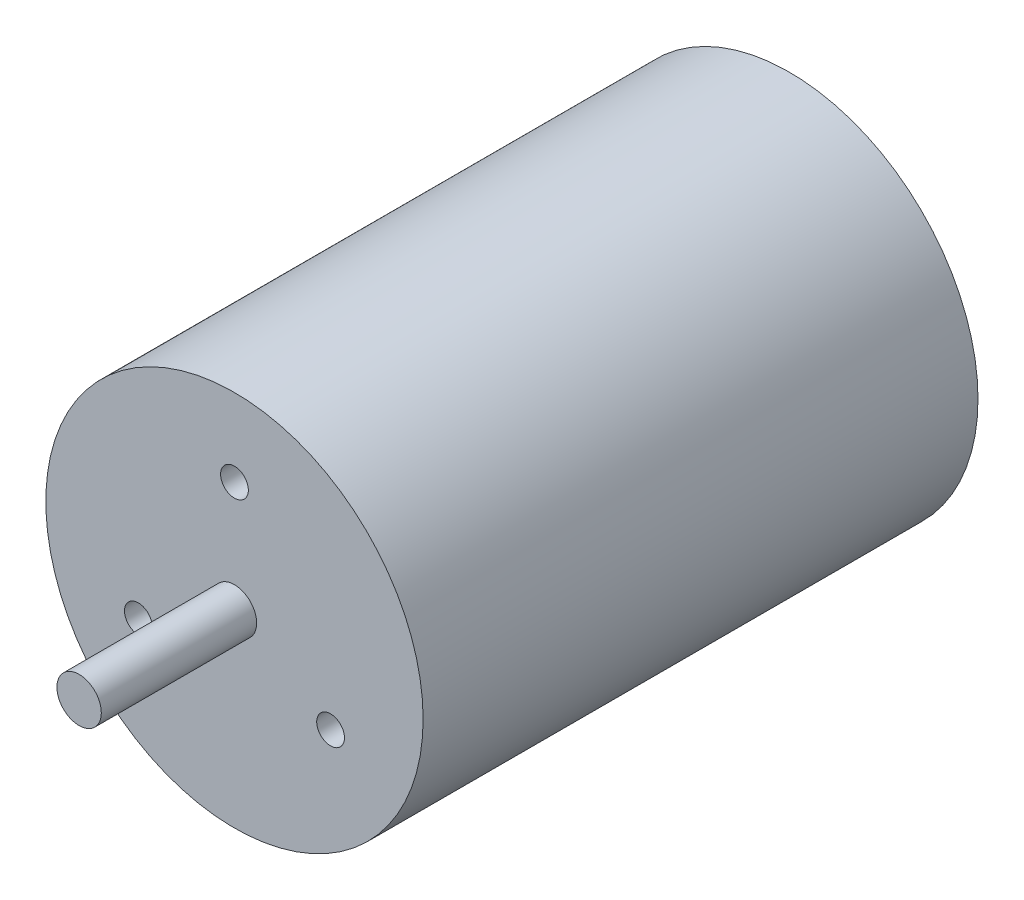
ISO-10303-21;
HEADER;
FILE_DESCRIPTION(('STEP AP214'),'2;1');
FILE_NAME('part.step','',(''),(''),'','','');
FILE_SCHEMA(('AUTOMOTIVE_DESIGN { 1 0 10303 214 1 1 1 1 }'));
ENDSEC;
DATA;
#1=APPLICATION_CONTEXT('core data for automotive mechanical design processes');
#2=APPLICATION_PROTOCOL_DEFINITION('international standard','automotive_design',2000,#1);
#3=PRODUCT_CONTEXT('',#1,'mechanical');
#4=PRODUCT('Part','Part','',(#3));
#5=PRODUCT_RELATED_PRODUCT_CATEGORY('part','',(#4));
#6=PRODUCT_DEFINITION_FORMATION('','',#4);
#7=PRODUCT_DEFINITION_CONTEXT('part definition',#1,'design');
#8=PRODUCT_DEFINITION('design','',#6,#7);
#9=PRODUCT_DEFINITION_SHAPE('','',#8);
#10=(LENGTH_UNIT() NAMED_UNIT(*) SI_UNIT(.MILLI.,.METRE.));
#11=(NAMED_UNIT(*) PLANE_ANGLE_UNIT() SI_UNIT($,.RADIAN.));
#12=(NAMED_UNIT(*) SI_UNIT($,.STERADIAN.) SOLID_ANGLE_UNIT());
#13=UNCERTAINTY_MEASURE_WITH_UNIT(LENGTH_MEASURE(1.E-05),#10,'distance_accuracy_value','');
#14=(GEOMETRIC_REPRESENTATION_CONTEXT(3) GLOBAL_UNCERTAINTY_ASSIGNED_CONTEXT((#13)) GLOBAL_UNIT_ASSIGNED_CONTEXT((#10,
#11,#12)) REPRESENTATION_CONTEXT('',''));
#15=CARTESIAN_POINT('',(0.,0.,0.));
#16=DIRECTION('',(0.,0.,1.));
#17=DIRECTION('',(1.,0.,0.));
#18=AXIS2_PLACEMENT_3D('',#15,#16,#17);
#19=CARTESIAN_POINT('',(0.,0.,0.));
#20=DIRECTION('',(0.,0.,1.));
#21=DIRECTION('',(1.,0.,0.));
#22=AXIS2_PLACEMENT_3D('',#19,#20,#21);
#23=PLANE('',#22);
#24=CARTESIAN_POINT('',(0.,0.,0.));
#25=DIRECTION('',(0.,0.,1.));
#26=DIRECTION('',(1.,0.,0.));
#27=AXIS2_PLACEMENT_3D('',#24,#25,#26);
#28=CIRCLE('',#27,34.);
#29=CARTESIAN_POINT('',(34.,0.,0.));
#30=VERTEX_POINT('',#29);
#31=EDGE_CURVE('E89',#30,#30,#28,.T.);
#32=ORIENTED_EDGE('',*,*,#31,.F.);
#33=EDGE_LOOP('',(#32));
#34=FACE_BOUND('',#33,.T.);
#35=CARTESIAN_POINT('',(0.,0.,0.));
#36=DIRECTION('',(0.,0.,1.));
#37=DIRECTION('',(1.,0.,0.));
#38=AXIS2_PLACEMENT_3D('',#35,#36,#37);
#39=CIRCLE('',#38,15.);
#40=CARTESIAN_POINT('',(15.,0.,0.));
#41=VERTEX_POINT('',#40);
#42=EDGE_CURVE('E11',#41,#41,#39,.F.);
#43=ORIENTED_EDGE('',*,*,#42,.F.);
#44=EDGE_LOOP('',(#43));
#45=FACE_BOUND('',#44,.T.);
#46=ADVANCED_FACE('F38',(#34,#45),#23,.F.);
#47=CARTESIAN_POINT('',(0.,0.,100.));
#48=DIRECTION('',(0.,0.,1.));
#49=DIRECTION('',(1.,0.,0.));
#50=AXIS2_PLACEMENT_3D('',#47,#48,#49);
#51=PLANE('',#50);
#52=CARTESIAN_POINT('',(0.,20.,100.));
#53=DIRECTION('',(0.,0.,1.));
#54=DIRECTION('',(1.,0.,0.));
#55=AXIS2_PLACEMENT_3D('',#52,#53,#54);
#56=CIRCLE('',#55,2.5);
#57=CARTESIAN_POINT('',(2.5,20.,100.));
#58=VERTEX_POINT('',#57);
#59=EDGE_CURVE('E67',#58,#58,#56,.T.);
#60=ORIENTED_EDGE('',*,*,#59,.F.);
#61=EDGE_LOOP('',(#60));
#62=FACE_BOUND('',#61,.T.);
#63=CARTESIAN_POINT('',(17.3205080756888,-9.99999999999999,100.));
#64=DIRECTION('',(0.,0.,1.));
#65=DIRECTION('',(1.,0.,0.));
#66=AXIS2_PLACEMENT_3D('',#63,#64,#65);
#67=CIRCLE('',#66,2.5);
#68=CARTESIAN_POINT('',(19.8205080756888,-9.99999999999999,100.));
#69=VERTEX_POINT('',#68);
#70=EDGE_CURVE('E66',#69,#69,#67,.T.);
#71=ORIENTED_EDGE('',*,*,#70,.F.);
#72=EDGE_LOOP('',(#71));
#73=FACE_BOUND('',#72,.T.);
#74=CARTESIAN_POINT('',(-17.3205080756888,-10.,100.));
#75=DIRECTION('',(0.,0.,1.));
#76=DIRECTION('',(1.,0.,0.));
#77=AXIS2_PLACEMENT_3D('',#74,#75,#76);
#78=CIRCLE('',#77,2.5);
#79=CARTESIAN_POINT('',(-14.8205080756888,-10.,100.));
#80=VERTEX_POINT('',#79);
#81=EDGE_CURVE('E79',#80,#80,#78,.T.);
#82=ORIENTED_EDGE('',*,*,#81,.F.);
#83=EDGE_LOOP('',(#82));
#84=FACE_BOUND('',#83,.T.);
#85=CARTESIAN_POINT('',(0.,0.,100.));
#86=DIRECTION('',(0.,0.,1.));
#87=DIRECTION('',(1.,0.,0.));
#88=AXIS2_PLACEMENT_3D('',#85,#86,#87);
#89=CIRCLE('',#88,34.);
#90=CARTESIAN_POINT('',(34.,0.,100.));
#91=VERTEX_POINT('',#90);
#92=EDGE_CURVE('E46',#91,#91,#89,.T.);
#93=ORIENTED_EDGE('',*,*,#92,.T.);
#94=EDGE_LOOP('',(#93));
#95=FACE_BOUND('',#94,.T.);
#96=CARTESIAN_POINT('',(0.,0.,100.));
#97=DIRECTION('',(0.,0.,1.));
#98=DIRECTION('',(1.,0.,0.));
#99=AXIS2_PLACEMENT_3D('',#96,#97,#98);
#100=CIRCLE('',#99,4.);
#101=CARTESIAN_POINT('',(4.,0.,100.));
#102=VERTEX_POINT('',#101);
#103=EDGE_CURVE('E85',#102,#102,#100,.T.);
#104=ORIENTED_EDGE('',*,*,#103,.F.);
#105=EDGE_LOOP('',(#104));
#106=FACE_BOUND('',#105,.T.);
#107=ADVANCED_FACE('F99',(#62,#73,#84,#95,#106),#51,.T.);
#108=CARTESIAN_POINT('',(0.,0.,100.));
#109=DIRECTION('',(0.,0.,-1.));
#110=DIRECTION('',(-1.,0.,0.));
#111=AXIS2_PLACEMENT_3D('',#108,#109,#110);
#112=CYLINDRICAL_SURFACE('',#111,34.);
#113=ORIENTED_EDGE('',*,*,#92,.F.);
#114=EDGE_LOOP('',(#113));
#115=FACE_BOUND('',#114,.T.);
#116=ORIENTED_EDGE('',*,*,#31,.T.);
#117=EDGE_LOOP('',(#116));
#118=FACE_BOUND('',#117,.T.);
#119=ADVANCED_FACE('F40',(#115,#118),#112,.T.);
#120=CARTESIAN_POINT('',(0.,0.,128.));
#121=DIRECTION('',(0.,0.,-1.));
#122=DIRECTION('',(-1.,0.,0.));
#123=AXIS2_PLACEMENT_3D('',#120,#121,#122);
#124=CYLINDRICAL_SURFACE('',#123,4.);
#125=CARTESIAN_POINT('',(0.,0.,128.));
#126=DIRECTION('',(0.,0.,1.));
#127=DIRECTION('',(1.,0.,0.));
#128=AXIS2_PLACEMENT_3D('',#125,#126,#127);
#129=CIRCLE('',#128,4.);
#130=CARTESIAN_POINT('',(4.,0.,128.));
#131=VERTEX_POINT('',#130);
#132=EDGE_CURVE('E86',#131,#131,#129,.T.);
#133=ORIENTED_EDGE('',*,*,#132,.F.);
#134=EDGE_LOOP('',(#133));
#135=FACE_BOUND('',#134,.T.);
#136=ORIENTED_EDGE('',*,*,#103,.T.);
#137=EDGE_LOOP('',(#136));
#138=FACE_BOUND('',#137,.T.);
#139=ADVANCED_FACE('F132',(#135,#138),#124,.T.);
#140=CARTESIAN_POINT('',(0.,0.,128.));
#141=DIRECTION('',(0.,0.,1.));
#142=DIRECTION('',(1.,0.,0.));
#143=AXIS2_PLACEMENT_3D('',#140,#141,#142);
#144=PLANE('',#143);
#145=ORIENTED_EDGE('',*,*,#132,.T.);
#146=EDGE_LOOP('',(#145));
#147=FACE_BOUND('',#146,.T.);
#148=ADVANCED_FACE('F129',(#147),#144,.T.);
#149=CARTESIAN_POINT('',(-17.3205080756888,-10.,85.0013));
#150=DIRECTION('',(0.,0.,1.));
#151=DIRECTION('',(1.,0.,0.));
#152=AXIS2_PLACEMENT_3D('',#149,#150,#151);
#153=CONICAL_SURFACE('',#152,2.5,1.02974425867665);
#154=CARTESIAN_POINT('',(-17.3205080756888,-10.,83.4991484524311));
#155=VERTEX_POINT('',#154);
#156=VERTEX_LOOP('',#155);
#157=FACE_BOUND('',#156,.T.);
#158=CARTESIAN_POINT('',(-17.3205080756888,-10.,85.0013));
#159=DIRECTION('',(0.,0.,1.));
#160=DIRECTION('',(1.,0.,0.));
#161=AXIS2_PLACEMENT_3D('',#158,#159,#160);
#162=CIRCLE('',#161,2.5);
#163=CARTESIAN_POINT('',(-14.8205080756888,-10.,85.0013));
#164=VERTEX_POINT('',#163);
#165=EDGE_CURVE('E82',#164,#164,#162,.T.);
#166=ORIENTED_EDGE('',*,*,#165,.T.);
#167=EDGE_LOOP('',(#166));
#168=FACE_BOUND('',#167,.T.);
#169=ADVANCED_FACE('F125',(#157,#168),#153,.F.);
#170=CARTESIAN_POINT('',(-17.3205080756888,-10.,100.));
#171=DIRECTION('',(0.,0.,1.));
#172=DIRECTION('',(1.,0.,0.));
#173=AXIS2_PLACEMENT_3D('',#170,#171,#172);
#174=CYLINDRICAL_SURFACE('',#173,2.5);
#175=ORIENTED_EDGE('',*,*,#165,.F.);
#176=EDGE_LOOP('',(#175));
#177=FACE_BOUND('',#176,.T.);
#178=ORIENTED_EDGE('',*,*,#81,.T.);
#179=EDGE_LOOP('',(#178));
#180=FACE_BOUND('',#179,.T.);
#181=ADVANCED_FACE('F122',(#177,#180),#174,.F.);
#182=CARTESIAN_POINT('',(17.3205080756888,-9.99999999999999,85.0013));
#183=DIRECTION('',(0.,0.,1.));
#184=DIRECTION('',(1.,0.,0.));
#185=AXIS2_PLACEMENT_3D('',#182,#183,#184);
#186=CONICAL_SURFACE('',#185,2.5,1.02974425867665);
#187=CARTESIAN_POINT('',(17.3205080756888,-9.99999999999999,83.4991484524311));
#188=VERTEX_POINT('',#187);
#189=VERTEX_LOOP('',#188);
#190=FACE_BOUND('',#189,.T.);
#191=CARTESIAN_POINT('',(17.3205080756888,-9.99999999999999,85.0013));
#192=DIRECTION('',(0.,0.,1.));
#193=DIRECTION('',(1.,0.,0.));
#194=AXIS2_PLACEMENT_3D('',#191,#192,#193);
#195=CIRCLE('',#194,2.5);
#196=CARTESIAN_POINT('',(19.8205080756888,-9.99999999999999,85.0013));
#197=VERTEX_POINT('',#196);
#198=EDGE_CURVE('E70',#197,#197,#195,.T.);
#199=ORIENTED_EDGE('',*,*,#198,.T.);
#200=EDGE_LOOP('',(#199));
#201=FACE_BOUND('',#200,.T.);
#202=ADVANCED_FACE('F118',(#190,#201),#186,.F.);
#203=CARTESIAN_POINT('',(17.3205080756888,-9.99999999999999,100.));
#204=DIRECTION('',(0.,0.,1.));
#205=DIRECTION('',(1.,0.,0.));
#206=AXIS2_PLACEMENT_3D('',#203,#204,#205);
#207=CYLINDRICAL_SURFACE('',#206,2.5);
#208=ORIENTED_EDGE('',*,*,#198,.F.);
#209=EDGE_LOOP('',(#208));
#210=FACE_BOUND('',#209,.T.);
#211=ORIENTED_EDGE('',*,*,#70,.T.);
#212=EDGE_LOOP('',(#211));
#213=FACE_BOUND('',#212,.T.);
#214=ADVANCED_FACE('F60',(#210,#213),#207,.F.);
#215=CARTESIAN_POINT('',(0.,20.,85.0013));
#216=DIRECTION('',(0.,0.,1.));
#217=DIRECTION('',(1.,0.,0.));
#218=AXIS2_PLACEMENT_3D('',#215,#216,#217);
#219=CONICAL_SURFACE('',#218,2.5,1.02974425867665);
#220=CARTESIAN_POINT('',(0.,20.,83.4991484524311));
#221=VERTEX_POINT('',#220);
#222=VERTEX_LOOP('',#221);
#223=FACE_BOUND('',#222,.T.);
#224=CARTESIAN_POINT('',(0.,20.,85.0013));
#225=DIRECTION('',(0.,0.,1.));
#226=DIRECTION('',(1.,0.,0.));
#227=AXIS2_PLACEMENT_3D('',#224,#225,#226);
#228=CIRCLE('',#227,2.5);
#229=CARTESIAN_POINT('',(2.5,20.,85.0013));
#230=VERTEX_POINT('',#229);
#231=EDGE_CURVE('E64',#230,#230,#228,.T.);
#232=ORIENTED_EDGE('',*,*,#231,.T.);
#233=EDGE_LOOP('',(#232));
#234=FACE_BOUND('',#233,.T.);
#235=ADVANCED_FACE('F56',(#223,#234),#219,.F.);
#236=CARTESIAN_POINT('',(0.,20.,100.));
#237=DIRECTION('',(0.,0.,1.));
#238=DIRECTION('',(1.,0.,0.));
#239=AXIS2_PLACEMENT_3D('',#236,#237,#238);
#240=CYLINDRICAL_SURFACE('',#239,2.5);
#241=ORIENTED_EDGE('',*,*,#231,.F.);
#242=EDGE_LOOP('',(#241));
#243=FACE_BOUND('',#242,.T.);
#244=ORIENTED_EDGE('',*,*,#59,.T.);
#245=EDGE_LOOP('',(#244));
#246=FACE_BOUND('',#245,.T.);
#247=ADVANCED_FACE('F59',(#243,#246),#240,.F.);
#248=CARTESIAN_POINT('',(0.,0.,-8.));
#249=DIRECTION('',(0.,0.,1.));
#250=DIRECTION('',(1.,0.,0.));
#251=AXIS2_PLACEMENT_3D('',#248,#249,#250);
#252=CYLINDRICAL_SURFACE('',#251,15.);
#253=CARTESIAN_POINT('',(0.,0.,-8.));
#254=DIRECTION('',(0.,0.,-1.));
#255=DIRECTION('',(-1.,0.,0.));
#256=AXIS2_PLACEMENT_3D('',#253,#254,#255);
#257=CIRCLE('',#256,15.);
#258=CARTESIAN_POINT('',(-15.,0.,-8.));
#259=VERTEX_POINT('',#258);
#260=EDGE_CURVE('E73',#259,#259,#257,.T.);
#261=ORIENTED_EDGE('',*,*,#260,.F.);
#262=EDGE_LOOP('',(#261));
#263=FACE_BOUND('',#262,.T.);
#264=ORIENTED_EDGE('',*,*,#42,.T.);
#265=EDGE_LOOP('',(#264));
#266=FACE_BOUND('',#265,.T.);
#267=ADVANCED_FACE('F102',(#263,#266),#252,.T.);
#268=CARTESIAN_POINT('',(0.,0.,-8.));
#269=DIRECTION('',(0.,0.,-1.));
#270=DIRECTION('',(-1.,0.,0.));
#271=AXIS2_PLACEMENT_3D('',#268,#269,#270);
#272=PLANE('',#271);
#273=ORIENTED_EDGE('',*,*,#260,.T.);
#274=EDGE_LOOP('',(#273));
#275=FACE_BOUND('',#274,.T.);
#276=ADVANCED_FACE('F104',(#275),#272,.T.);
#277=CLOSED_SHELL('',(#46,#107,#119,#139,#148,#169,#181,#202,#214,#235,#247,#267,#276));
#278=MANIFOLD_SOLID_BREP('B2',#277);
#279=ADVANCED_BREP_SHAPE_REPRESENTATION('',(#18,#278),#14);
#280=SHAPE_DEFINITION_REPRESENTATION(#9,#279);
ENDSEC;
END-ISO-10303-21;
